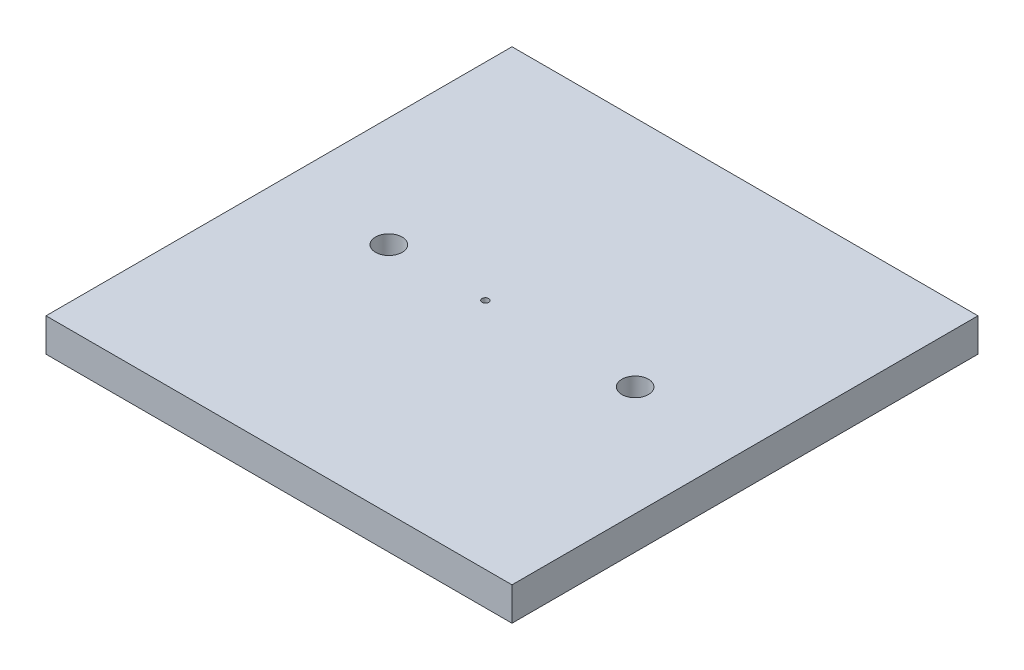
ISO-10303-21;
HEADER;
FILE_DESCRIPTION(('STEP AP214'),'2;1');
FILE_NAME('part.step','',(''),(''),'','','');
FILE_SCHEMA(('AUTOMOTIVE_DESIGN { 1 0 10303 214 1 1 1 1 }'));
ENDSEC;
DATA;
#1=APPLICATION_CONTEXT('core data for automotive mechanical design processes');
#2=APPLICATION_PROTOCOL_DEFINITION('international standard','automotive_design',2000,#1);
#3=PRODUCT_CONTEXT('',#1,'mechanical');
#4=PRODUCT('Part','Part','',(#3));
#5=PRODUCT_RELATED_PRODUCT_CATEGORY('part','',(#4));
#6=PRODUCT_DEFINITION_FORMATION('','',#4);
#7=PRODUCT_DEFINITION_CONTEXT('part definition',#1,'design');
#8=PRODUCT_DEFINITION('design','',#6,#7);
#9=PRODUCT_DEFINITION_SHAPE('','',#8);
#10=(LENGTH_UNIT() NAMED_UNIT(*) SI_UNIT(.MILLI.,.METRE.));
#11=(NAMED_UNIT(*) PLANE_ANGLE_UNIT() SI_UNIT($,.RADIAN.));
#12=(NAMED_UNIT(*) SI_UNIT($,.STERADIAN.) SOLID_ANGLE_UNIT());
#13=UNCERTAINTY_MEASURE_WITH_UNIT(LENGTH_MEASURE(1.E-05),#10,'distance_accuracy_value','');
#14=(GEOMETRIC_REPRESENTATION_CONTEXT(3) GLOBAL_UNCERTAINTY_ASSIGNED_CONTEXT((#13)) GLOBAL_UNIT_ASSIGNED_CONTEXT((#10,
#11,#12)) REPRESENTATION_CONTEXT('',''));
#15=CARTESIAN_POINT('',(0.,0.,0.));
#16=DIRECTION('',(0.,0.,1.));
#17=DIRECTION('',(1.,0.,0.));
#18=AXIS2_PLACEMENT_3D('',#15,#16,#17);
#19=CARTESIAN_POINT('',(-35.,5.,-35.));
#20=DIRECTION('',(1.,0.,0.));
#21=DIRECTION('',(0.,0.,-1.));
#22=AXIS2_PLACEMENT_3D('',#19,#20,#21);
#23=PLANE('',#22);
#24=DIRECTION('',(0.,0.,1.));
#25=VECTOR('',#24,1.);
#26=CARTESIAN_POINT('',(-35.,0.,-35.));
#27=LINE('',#26,#25);
#28=CARTESIAN_POINT('',(-35.,0.,-35.));
#29=VERTEX_POINT('',#28);
#30=CARTESIAN_POINT('',(-35.,0.,35.));
#31=VERTEX_POINT('',#30);
#32=EDGE_CURVE('E96',#29,#31,#27,.T.);
#33=ORIENTED_EDGE('',*,*,#32,.T.);
#34=DIRECTION('',(0.,-1.,0.));
#35=VECTOR('',#34,1.);
#36=CARTESIAN_POINT('',(-35.,5.,35.));
#37=LINE('',#36,#35);
#38=CARTESIAN_POINT('',(-35.,5.,35.));
#39=VERTEX_POINT('',#38);
#40=EDGE_CURVE('E11',#39,#31,#37,.T.);
#41=ORIENTED_EDGE('',*,*,#40,.F.);
#42=DIRECTION('',(0.,0.,1.));
#43=VECTOR('',#42,1.);
#44=CARTESIAN_POINT('',(-35.,5.,-35.));
#45=LINE('',#44,#43);
#46=CARTESIAN_POINT('',(-35.,5.,-35.));
#47=VERTEX_POINT('',#46);
#48=EDGE_CURVE('E82',#47,#39,#45,.T.);
#49=ORIENTED_EDGE('',*,*,#48,.F.);
#50=DIRECTION('',(0.,-1.,0.));
#51=VECTOR('',#50,1.);
#52=CARTESIAN_POINT('',(-35.,5.,-35.));
#53=LINE('',#52,#51);
#54=EDGE_CURVE('E49',#47,#29,#53,.T.);
#55=ORIENTED_EDGE('',*,*,#54,.T.);
#56=EDGE_LOOP('',(#33,#41,#49,#55));
#57=FACE_BOUND('',#56,.T.);
#58=ADVANCED_FACE('F33',(#57),#23,.F.);
#59=CARTESIAN_POINT('',(-35.,5.,35.));
#60=DIRECTION('',(0.,0.,-1.));
#61=DIRECTION('',(-1.,0.,0.));
#62=AXIS2_PLACEMENT_3D('',#59,#60,#61);
#63=PLANE('',#62);
#64=DIRECTION('',(1.,0.,0.));
#65=VECTOR('',#64,1.);
#66=CARTESIAN_POINT('',(-35.,0.,35.));
#67=LINE('',#66,#65);
#68=CARTESIAN_POINT('',(35.,0.,35.));
#69=VERTEX_POINT('',#68);
#70=EDGE_CURVE('E87',#31,#69,#67,.T.);
#71=ORIENTED_EDGE('',*,*,#70,.T.);
#72=DIRECTION('',(0.,-1.,0.));
#73=VECTOR('',#72,1.);
#74=CARTESIAN_POINT('',(35.,5.,35.));
#75=LINE('',#74,#73);
#76=CARTESIAN_POINT('',(35.,5.,35.));
#77=VERTEX_POINT('',#76);
#78=EDGE_CURVE('E41',#77,#69,#75,.T.);
#79=ORIENTED_EDGE('',*,*,#78,.F.);
#80=DIRECTION('',(1.,0.,0.));
#81=VECTOR('',#80,1.);
#82=CARTESIAN_POINT('',(-35.,5.,35.));
#83=LINE('',#82,#81);
#84=EDGE_CURVE('E74',#39,#77,#83,.T.);
#85=ORIENTED_EDGE('',*,*,#84,.F.);
#86=ORIENTED_EDGE('',*,*,#40,.T.);
#87=EDGE_LOOP('',(#71,#79,#85,#86));
#88=FACE_BOUND('',#87,.T.);
#89=ADVANCED_FACE('F86',(#88),#63,.F.);
#90=CARTESIAN_POINT('',(35.,5.,-35.));
#91=DIRECTION('',(1.,0.,0.));
#92=DIRECTION('',(0.,0.,-1.));
#93=AXIS2_PLACEMENT_3D('',#90,#91,#92);
#94=PLANE('',#93);
#95=DIRECTION('',(0.,0.,1.));
#96=VECTOR('',#95,1.);
#97=CARTESIAN_POINT('',(35.,0.,-35.));
#98=LINE('',#97,#96);
#99=CARTESIAN_POINT('',(35.,0.,-35.));
#100=VERTEX_POINT('',#99);
#101=EDGE_CURVE('E100',#100,#69,#98,.T.);
#102=ORIENTED_EDGE('',*,*,#101,.F.);
#103=DIRECTION('',(0.,-1.,0.));
#104=VECTOR('',#103,1.);
#105=CARTESIAN_POINT('',(35.,5.,-35.));
#106=LINE('',#105,#104);
#107=CARTESIAN_POINT('',(35.,5.,-35.));
#108=VERTEX_POINT('',#107);
#109=EDGE_CURVE('E63',#108,#100,#106,.T.);
#110=ORIENTED_EDGE('',*,*,#109,.F.);
#111=DIRECTION('',(0.,0.,1.));
#112=VECTOR('',#111,1.);
#113=CARTESIAN_POINT('',(35.,5.,-35.));
#114=LINE('',#113,#112);
#115=EDGE_CURVE('E81',#108,#77,#114,.T.);
#116=ORIENTED_EDGE('',*,*,#115,.T.);
#117=ORIENTED_EDGE('',*,*,#78,.T.);
#118=EDGE_LOOP('',(#102,#110,#116,#117));
#119=FACE_BOUND('',#118,.T.);
#120=ADVANCED_FACE('F90',(#119),#94,.T.);
#121=CARTESIAN_POINT('',(-35.,5.,-35.));
#122=DIRECTION('',(0.,0.,-1.));
#123=DIRECTION('',(-1.,0.,0.));
#124=AXIS2_PLACEMENT_3D('',#121,#122,#123);
#125=PLANE('',#124);
#126=DIRECTION('',(1.,0.,0.));
#127=VECTOR('',#126,1.);
#128=CARTESIAN_POINT('',(-35.,0.,-35.));
#129=LINE('',#128,#127);
#130=EDGE_CURVE('E102',#29,#100,#129,.T.);
#131=ORIENTED_EDGE('',*,*,#130,.F.);
#132=ORIENTED_EDGE('',*,*,#54,.F.);
#133=DIRECTION('',(1.,0.,0.));
#134=VECTOR('',#133,1.);
#135=CARTESIAN_POINT('',(-35.,5.,-35.));
#136=LINE('',#135,#134);
#137=EDGE_CURVE('E91',#47,#108,#136,.T.);
#138=ORIENTED_EDGE('',*,*,#137,.T.);
#139=ORIENTED_EDGE('',*,*,#109,.T.);
#140=EDGE_LOOP('',(#131,#132,#138,#139));
#141=FACE_BOUND('',#140,.T.);
#142=ADVANCED_FACE('F154',(#141),#125,.T.);
#143=CARTESIAN_POINT('',(0.,5.,0.));
#144=DIRECTION('',(0.,1.,0.));
#145=DIRECTION('',(0.,0.,1.));
#146=AXIS2_PLACEMENT_3D('',#143,#144,#145);
#147=PLANE('',#146);
#148=CARTESIAN_POINT('',(-4.,5.,0.));
#149=DIRECTION('',(0.,1.,0.));
#150=DIRECTION('',(0.,0.,1.));
#151=AXIS2_PLACEMENT_3D('',#148,#149,#150);
#152=CIRCLE('',#151,0.500000000000001);
#153=CARTESIAN_POINT('',(-4.,5.,0.500000000000001));
#154=VERTEX_POINT('',#153);
#155=EDGE_CURVE('E125',#154,#154,#152,.T.);
#156=ORIENTED_EDGE('',*,*,#155,.F.);
#157=EDGE_LOOP('',(#156));
#158=FACE_BOUND('',#157,.T.);
#159=CARTESIAN_POINT('',(-18.5,5.,0.));
#160=DIRECTION('',(0.,1.,0.));
#161=DIRECTION('',(0.,0.,1.));
#162=AXIS2_PLACEMENT_3D('',#159,#160,#161);
#163=CIRCLE('',#162,2.);
#164=CARTESIAN_POINT('',(-18.5,5.,2.));
#165=VERTEX_POINT('',#164);
#166=EDGE_CURVE('E119',#165,#165,#163,.T.);
#167=ORIENTED_EDGE('',*,*,#166,.F.);
#168=EDGE_LOOP('',(#167));
#169=FACE_BOUND('',#168,.T.);
#170=CARTESIAN_POINT('',(18.5,5.,0.));
#171=DIRECTION('',(0.,1.,0.));
#172=DIRECTION('',(0.,0.,1.));
#173=AXIS2_PLACEMENT_3D('',#170,#171,#172);
#174=CIRCLE('',#173,2.);
#175=CARTESIAN_POINT('',(18.5,5.,2.00000000000001));
#176=VERTEX_POINT('',#175);
#177=EDGE_CURVE('E111',#176,#176,#174,.T.);
#178=ORIENTED_EDGE('',*,*,#177,.F.);
#179=EDGE_LOOP('',(#178));
#180=FACE_BOUND('',#179,.T.);
#181=ORIENTED_EDGE('',*,*,#48,.T.);
#182=ORIENTED_EDGE('',*,*,#84,.T.);
#183=ORIENTED_EDGE('',*,*,#115,.F.);
#184=ORIENTED_EDGE('',*,*,#137,.F.);
#185=EDGE_LOOP('',(#181,#182,#183,#184));
#186=FACE_BOUND('',#185,.T.);
#187=ADVANCED_FACE('F78',(#158,#169,#180,#186),#147,.T.);
#188=CARTESIAN_POINT('',(0.,0.,0.));
#189=DIRECTION('',(0.,1.,0.));
#190=DIRECTION('',(0.,0.,1.));
#191=AXIS2_PLACEMENT_3D('',#188,#189,#190);
#192=PLANE('',#191);
#193=CARTESIAN_POINT('',(0.,0.,0.));
#194=DIRECTION('',(0.,-1.,0.));
#195=DIRECTION('',(0.,0.,-1.));
#196=AXIS2_PLACEMENT_3D('',#193,#194,#195);
#197=CIRCLE('',#196,25.5);
#198=CARTESIAN_POINT('',(0.,0.,-25.5));
#199=VERTEX_POINT('',#198);
#200=EDGE_CURVE('E108',#199,#199,#197,.T.);
#201=ORIENTED_EDGE('',*,*,#200,.F.);
#202=EDGE_LOOP('',(#201));
#203=FACE_BOUND('',#202,.T.);
#204=ORIENTED_EDGE('',*,*,#32,.F.);
#205=ORIENTED_EDGE('',*,*,#130,.T.);
#206=ORIENTED_EDGE('',*,*,#101,.T.);
#207=ORIENTED_EDGE('',*,*,#70,.F.);
#208=EDGE_LOOP('',(#204,#205,#206,#207));
#209=FACE_BOUND('',#208,.T.);
#210=ADVANCED_FACE('F148',(#203,#209),#192,.F.);
#211=CARTESIAN_POINT('',(0.,2.,0.));
#212=DIRECTION('',(0.,-1.,0.));
#213=DIRECTION('',(0.,0.,-1.));
#214=AXIS2_PLACEMENT_3D('',#211,#212,#213);
#215=CYLINDRICAL_SURFACE('',#214,25.5);
#216=CARTESIAN_POINT('',(0.,2.,0.));
#217=DIRECTION('',(0.,-1.,0.));
#218=DIRECTION('',(0.,0.,-1.));
#219=AXIS2_PLACEMENT_3D('',#216,#217,#218);
#220=CIRCLE('',#219,25.5);
#221=CARTESIAN_POINT('',(0.,2.,-25.5));
#222=VERTEX_POINT('',#221);
#223=EDGE_CURVE('E98',#222,#222,#220,.T.);
#224=ORIENTED_EDGE('',*,*,#223,.F.);
#225=EDGE_LOOP('',(#224));
#226=FACE_BOUND('',#225,.T.);
#227=ORIENTED_EDGE('',*,*,#200,.T.);
#228=EDGE_LOOP('',(#227));
#229=FACE_BOUND('',#228,.T.);
#230=ADVANCED_FACE('F138',(#226,#229),#215,.F.);
#231=CARTESIAN_POINT('',(0.,2.,0.));
#232=DIRECTION('',(0.,-1.,0.));
#233=DIRECTION('',(0.,0.,-1.));
#234=AXIS2_PLACEMENT_3D('',#231,#232,#233);
#235=PLANE('',#234);
#236=CARTESIAN_POINT('',(-4.,2.,0.));
#237=DIRECTION('',(0.,-1.,0.));
#238=DIRECTION('',(0.,0.,-1.));
#239=AXIS2_PLACEMENT_3D('',#236,#237,#238);
#240=CIRCLE('',#239,0.500000000000001);
#241=CARTESIAN_POINT('',(-4.,2.,-0.500000000000001));
#242=VERTEX_POINT('',#241);
#243=EDGE_CURVE('E128',#242,#242,#240,.T.);
#244=ORIENTED_EDGE('',*,*,#243,.F.);
#245=EDGE_LOOP('',(#244));
#246=FACE_BOUND('',#245,.T.);
#247=CARTESIAN_POINT('',(18.5,2.,0.));
#248=DIRECTION('',(0.,-1.,0.));
#249=DIRECTION('',(0.,0.,-1.));
#250=AXIS2_PLACEMENT_3D('',#247,#248,#249);
#251=CIRCLE('',#250,2.);
#252=CARTESIAN_POINT('',(18.5,2.,-1.99999999999999));
#253=VERTEX_POINT('',#252);
#254=EDGE_CURVE('E116',#253,#253,#251,.T.);
#255=ORIENTED_EDGE('',*,*,#254,.F.);
#256=EDGE_LOOP('',(#255));
#257=FACE_BOUND('',#256,.T.);
#258=CARTESIAN_POINT('',(-18.5,2.,0.));
#259=DIRECTION('',(0.,-1.,0.));
#260=DIRECTION('',(0.,0.,-1.));
#261=AXIS2_PLACEMENT_3D('',#258,#259,#260);
#262=CIRCLE('',#261,2.);
#263=CARTESIAN_POINT('',(-18.5,2.,-2.));
#264=VERTEX_POINT('',#263);
#265=EDGE_CURVE('E122',#264,#264,#262,.T.);
#266=ORIENTED_EDGE('',*,*,#265,.F.);
#267=EDGE_LOOP('',(#266));
#268=FACE_BOUND('',#267,.T.);
#269=ORIENTED_EDGE('',*,*,#223,.T.);
#270=EDGE_LOOP('',(#269));
#271=FACE_BOUND('',#270,.T.);
#272=ADVANCED_FACE('F134',(#246,#257,#268,#271),#235,.T.);
#273=CARTESIAN_POINT('',(18.5,10.,0.));
#274=DIRECTION('',(0.,-1.,0.));
#275=DIRECTION('',(0.,0.,-1.));
#276=AXIS2_PLACEMENT_3D('',#273,#274,#275);
#277=CYLINDRICAL_SURFACE('',#276,2.);
#278=ORIENTED_EDGE('',*,*,#177,.T.);
#279=EDGE_LOOP('',(#278));
#280=FACE_BOUND('',#279,.T.);
#281=ORIENTED_EDGE('',*,*,#254,.T.);
#282=EDGE_LOOP('',(#281));
#283=FACE_BOUND('',#282,.T.);
#284=ADVANCED_FACE('F137',(#280,#283),#277,.F.);
#285=CARTESIAN_POINT('',(-18.5,10.,0.));
#286=DIRECTION('',(0.,-1.,0.));
#287=DIRECTION('',(0.,0.,-1.));
#288=AXIS2_PLACEMENT_3D('',#285,#286,#287);
#289=CYLINDRICAL_SURFACE('',#288,2.);
#290=ORIENTED_EDGE('',*,*,#166,.T.);
#291=EDGE_LOOP('',(#290));
#292=FACE_BOUND('',#291,.T.);
#293=ORIENTED_EDGE('',*,*,#265,.T.);
#294=EDGE_LOOP('',(#293));
#295=FACE_BOUND('',#294,.T.);
#296=ADVANCED_FACE('F203',(#292,#295),#289,.F.);
#297=CARTESIAN_POINT('',(-4.,12.,0.));
#298=DIRECTION('',(0.,-1.,0.));
#299=DIRECTION('',(0.,0.,-1.));
#300=AXIS2_PLACEMENT_3D('',#297,#298,#299);
#301=CYLINDRICAL_SURFACE('',#300,0.500000000000001);
#302=ORIENTED_EDGE('',*,*,#155,.T.);
#303=EDGE_LOOP('',(#302));
#304=FACE_BOUND('',#303,.T.);
#305=ORIENTED_EDGE('',*,*,#243,.T.);
#306=EDGE_LOOP('',(#305));
#307=FACE_BOUND('',#306,.T.);
#308=ADVANCED_FACE('F132',(#304,#307),#301,.F.);
#309=CLOSED_SHELL('',(#58,#89,#120,#142,#187,#210,#230,#272,#284,#296,#308));
#310=MANIFOLD_SOLID_BREP('B2',#309);
#311=ADVANCED_BREP_SHAPE_REPRESENTATION('',(#18,#310),#14);
#312=SHAPE_DEFINITION_REPRESENTATION(#9,#311);
ENDSEC;
END-ISO-10303-21;
